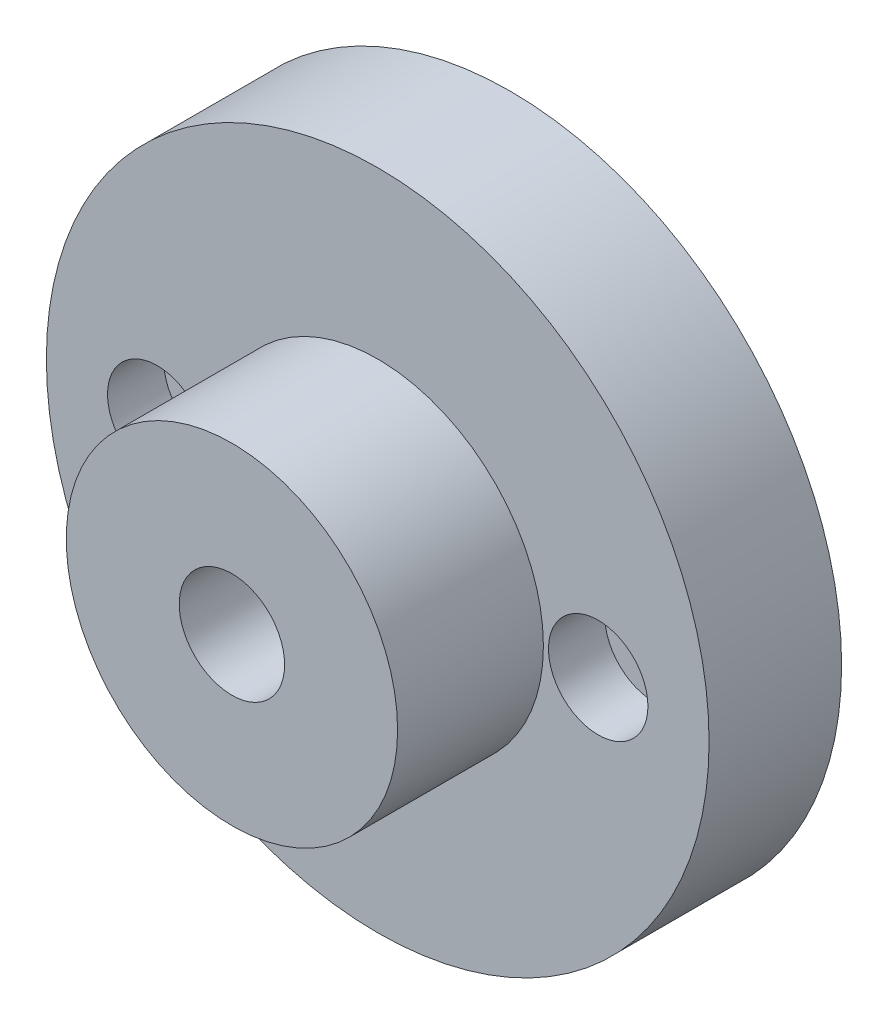
ISO-10303-21;
HEADER;
FILE_DESCRIPTION(('STEP AP214'),'2;1');
FILE_NAME('part.step','',(''),(''),'','','');
FILE_SCHEMA(('AUTOMOTIVE_DESIGN { 1 0 10303 214 1 1 1 1 }'));
ENDSEC;
DATA;
#1=APPLICATION_CONTEXT('core data for automotive mechanical design processes');
#2=APPLICATION_PROTOCOL_DEFINITION('international standard','automotive_design',2000,#1);
#3=PRODUCT_CONTEXT('',#1,'mechanical');
#4=PRODUCT('Part','Part','',(#3));
#5=PRODUCT_RELATED_PRODUCT_CATEGORY('part','',(#4));
#6=PRODUCT_DEFINITION_FORMATION('','',#4);
#7=PRODUCT_DEFINITION_CONTEXT('part definition',#1,'design');
#8=PRODUCT_DEFINITION('design','',#6,#7);
#9=PRODUCT_DEFINITION_SHAPE('','',#8);
#10=(LENGTH_UNIT() NAMED_UNIT(*) SI_UNIT(.MILLI.,.METRE.));
#11=(NAMED_UNIT(*) PLANE_ANGLE_UNIT() SI_UNIT($,.RADIAN.));
#12=(NAMED_UNIT(*) SI_UNIT($,.STERADIAN.) SOLID_ANGLE_UNIT());
#13=UNCERTAINTY_MEASURE_WITH_UNIT(LENGTH_MEASURE(1.E-05),#10,'distance_accuracy_value','');
#14=(GEOMETRIC_REPRESENTATION_CONTEXT(3) GLOBAL_UNCERTAINTY_ASSIGNED_CONTEXT((#13)) GLOBAL_UNIT_ASSIGNED_CONTEXT((#10,
#11,#12)) REPRESENTATION_CONTEXT('',''));
#15=CARTESIAN_POINT('',(0.,0.,0.));
#16=DIRECTION('',(0.,0.,1.));
#17=DIRECTION('',(1.,0.,0.));
#18=AXIS2_PLACEMENT_3D('',#15,#16,#17);
#19=CARTESIAN_POINT('',(8.45058,0.,5.08));
#20=DIRECTION('',(0.,0.,1.));
#21=DIRECTION('',(1.,0.,0.));
#22=AXIS2_PLACEMENT_3D('',#19,#20,#21);
#23=CYLINDRICAL_SURFACE('',#22,0.888999999999999);
#24=CARTESIAN_POINT('',(8.45058,0.,0.));
#25=DIRECTION('',(0.,0.,1.));
#26=DIRECTION('',(1.,0.,0.));
#27=AXIS2_PLACEMENT_3D('',#24,#25,#26);
#28=CIRCLE('',#27,0.888999999999999);
#29=CARTESIAN_POINT('',(9.33958,0.,0.));
#30=VERTEX_POINT('',#29);
#31=EDGE_CURVE('E75',#30,#30,#28,.T.);
#32=ORIENTED_EDGE('',*,*,#31,.F.);
#33=EDGE_LOOP('',(#32));
#34=FACE_BOUND('',#33,.T.);
#35=CARTESIAN_POINT('',(8.45058,0.,2.921));
#36=DIRECTION('',(0.,0.,1.));
#37=DIRECTION('',(1.,0.,0.));
#38=AXIS2_PLACEMENT_3D('',#35,#36,#37);
#39=CIRCLE('',#38,0.888999999999999);
#40=CARTESIAN_POINT('',(9.33958,0.,2.921));
#41=VERTEX_POINT('',#40);
#42=EDGE_CURVE('E40',#41,#41,#39,.F.);
#43=ORIENTED_EDGE('',*,*,#42,.F.);
#44=EDGE_LOOP('',(#43));
#45=FACE_BOUND('',#44,.T.);
#46=ADVANCED_FACE('F36',(#34,#45),#23,.F.);
#47=CARTESIAN_POINT('',(-8.45058,0.,5.08));
#48=DIRECTION('',(0.,0.,1.));
#49=DIRECTION('',(1.,0.,0.));
#50=AXIS2_PLACEMENT_3D('',#47,#48,#49);
#51=CYLINDRICAL_SURFACE('',#50,0.888999999999999);
#52=CARTESIAN_POINT('',(-8.45058,0.,0.));
#53=DIRECTION('',(0.,0.,1.));
#54=DIRECTION('',(1.,0.,0.));
#55=AXIS2_PLACEMENT_3D('',#52,#53,#54);
#56=CIRCLE('',#55,0.888999999999999);
#57=CARTESIAN_POINT('',(-7.56158,0.,0.));
#58=VERTEX_POINT('',#57);
#59=EDGE_CURVE('E72',#58,#58,#56,.T.);
#60=ORIENTED_EDGE('',*,*,#59,.F.);
#61=EDGE_LOOP('',(#60));
#62=FACE_BOUND('',#61,.T.);
#63=CARTESIAN_POINT('',(-8.45058,0.,2.921));
#64=DIRECTION('',(0.,0.,1.));
#65=DIRECTION('',(1.,0.,0.));
#66=AXIS2_PLACEMENT_3D('',#63,#64,#65);
#67=CIRCLE('',#66,0.888999999999999);
#68=CARTESIAN_POINT('',(-7.56158,0.,2.921));
#69=VERTEX_POINT('',#68);
#70=EDGE_CURVE('E66',#69,#69,#67,.F.);
#71=ORIENTED_EDGE('',*,*,#70,.F.);
#72=EDGE_LOOP('',(#71));
#73=FACE_BOUND('',#72,.T.);
#74=ADVANCED_FACE('F100',(#62,#73),#51,.F.);
#75=CARTESIAN_POINT('',(0.,0.,5.08));
#76=DIRECTION('',(0.,0.,-1.));
#77=DIRECTION('',(-1.,0.,0.));
#78=AXIS2_PLACEMENT_3D('',#75,#76,#77);
#79=CYLINDRICAL_SURFACE('',#78,12.7);
#80=CARTESIAN_POINT('',(0.,0.,5.08));
#81=DIRECTION('',(0.,0.,1.));
#82=DIRECTION('',(1.,0.,0.));
#83=AXIS2_PLACEMENT_3D('',#80,#81,#82);
#84=CIRCLE('',#83,12.7);
#85=CARTESIAN_POINT('',(12.7,0.,5.08));
#86=VERTEX_POINT('',#85);
#87=EDGE_CURVE('E44',#86,#86,#84,.T.);
#88=ORIENTED_EDGE('',*,*,#87,.F.);
#89=EDGE_LOOP('',(#88));
#90=FACE_BOUND('',#89,.T.);
#91=CARTESIAN_POINT('',(0.,0.,0.));
#92=DIRECTION('',(0.,0.,1.));
#93=DIRECTION('',(1.,0.,0.));
#94=AXIS2_PLACEMENT_3D('',#91,#92,#93);
#95=CIRCLE('',#94,12.7);
#96=CARTESIAN_POINT('',(12.7,0.,0.));
#97=VERTEX_POINT('',#96);
#98=EDGE_CURVE('E86',#97,#97,#95,.T.);
#99=ORIENTED_EDGE('',*,*,#98,.T.);
#100=EDGE_LOOP('',(#99));
#101=FACE_BOUND('',#100,.T.);
#102=ADVANCED_FACE('F38',(#90,#101),#79,.T.);
#103=CARTESIAN_POINT('',(0.,0.,5.08));
#104=DIRECTION('',(0.,0.,1.));
#105=DIRECTION('',(1.,0.,0.));
#106=AXIS2_PLACEMENT_3D('',#103,#104,#105);
#107=PLANE('',#106);
#108=CARTESIAN_POINT('',(-8.45058,0.,5.08));
#109=DIRECTION('',(0.,0.,1.));
#110=DIRECTION('',(1.,0.,0.));
#111=AXIS2_PLACEMENT_3D('',#108,#109,#110);
#112=CIRCLE('',#111,1.905);
#113=CARTESIAN_POINT('',(-6.54558,0.,5.08));
#114=VERTEX_POINT('',#113);
#115=EDGE_CURVE('E67',#114,#114,#112,.T.);
#116=ORIENTED_EDGE('',*,*,#115,.F.);
#117=EDGE_LOOP('',(#116));
#118=FACE_BOUND('',#117,.T.);
#119=CARTESIAN_POINT('',(8.45058,0.,5.08));
#120=DIRECTION('',(0.,0.,1.));
#121=DIRECTION('',(1.,0.,0.));
#122=AXIS2_PLACEMENT_3D('',#119,#120,#121);
#123=CIRCLE('',#122,1.905);
#124=CARTESIAN_POINT('',(10.35558,0.,5.08));
#125=VERTEX_POINT('',#124);
#126=EDGE_CURVE('E57',#125,#125,#123,.T.);
#127=ORIENTED_EDGE('',*,*,#126,.F.);
#128=EDGE_LOOP('',(#127));
#129=FACE_BOUND('',#128,.T.);
#130=CARTESIAN_POINT('',(0.,0.,5.08));
#131=DIRECTION('',(0.,0.,1.));
#132=DIRECTION('',(1.,0.,0.));
#133=AXIS2_PLACEMENT_3D('',#130,#131,#132);
#134=CIRCLE('',#133,6.35);
#135=CARTESIAN_POINT('',(6.35,0.,5.08));
#136=VERTEX_POINT('',#135);
#137=EDGE_CURVE('E11',#136,#136,#134,.T.);
#138=ORIENTED_EDGE('',*,*,#137,.F.);
#139=EDGE_LOOP('',(#138));
#140=FACE_BOUND('',#139,.T.);
#141=ORIENTED_EDGE('',*,*,#87,.T.);
#142=EDGE_LOOP('',(#141));
#143=FACE_BOUND('',#142,.T.);
#144=ADVANCED_FACE('F129',(#118,#129,#140,#143),#107,.T.);
#145=CARTESIAN_POINT('',(0.,0.,0.));
#146=DIRECTION('',(0.,0.,1.));
#147=DIRECTION('',(1.,0.,0.));
#148=AXIS2_PLACEMENT_3D('',#145,#146,#147);
#149=PLANE('',#148);
#150=CARTESIAN_POINT('',(1.99898,0.,0.));
#151=DIRECTION('',(0.,0.,-1.));
#152=DIRECTION('',(-1.,0.,0.));
#153=AXIS2_PLACEMENT_3D('',#150,#151,#152);
#154=CIRCLE('',#153,1.905);
#155=CARTESIAN_POINT('',(0.0939799999999994,0.,0.));
#156=VERTEX_POINT('',#155);
#157=EDGE_CURVE('E55',#156,#156,#154,.T.);
#158=ORIENTED_EDGE('',*,*,#157,.F.);
#159=EDGE_LOOP('',(#158));
#160=FACE_BOUND('',#159,.T.);
#161=ORIENTED_EDGE('',*,*,#59,.T.);
#162=EDGE_LOOP('',(#161));
#163=FACE_BOUND('',#162,.T.);
#164=ORIENTED_EDGE('',*,*,#31,.T.);
#165=EDGE_LOOP('',(#164));
#166=FACE_BOUND('',#165,.T.);
#167=ORIENTED_EDGE('',*,*,#98,.F.);
#168=EDGE_LOOP('',(#167));
#169=FACE_BOUND('',#168,.T.);
#170=ADVANCED_FACE('F127',(#160,#163,#166,#169),#149,.F.);
#171=CARTESIAN_POINT('',(0.,0.,10.668));
#172=DIRECTION('',(0.,0.,-1.));
#173=DIRECTION('',(-1.,0.,0.));
#174=AXIS2_PLACEMENT_3D('',#171,#172,#173);
#175=CYLINDRICAL_SURFACE('',#174,6.35);
#176=CARTESIAN_POINT('',(0.,0.,10.668));
#177=DIRECTION('',(0.,0.,1.));
#178=DIRECTION('',(1.,0.,0.));
#179=AXIS2_PLACEMENT_3D('',#176,#177,#178);
#180=CIRCLE('',#179,6.35);
#181=CARTESIAN_POINT('',(6.35,0.,10.668));
#182=VERTEX_POINT('',#181);
#183=EDGE_CURVE('E82',#182,#182,#180,.T.);
#184=ORIENTED_EDGE('',*,*,#183,.F.);
#185=EDGE_LOOP('',(#184));
#186=FACE_BOUND('',#185,.T.);
#187=ORIENTED_EDGE('',*,*,#137,.T.);
#188=EDGE_LOOP('',(#187));
#189=FACE_BOUND('',#188,.T.);
#190=ADVANCED_FACE('F123',(#186,#189),#175,.T.);
#191=CARTESIAN_POINT('',(0.,0.,10.668));
#192=DIRECTION('',(0.,0.,1.));
#193=DIRECTION('',(1.,0.,0.));
#194=AXIS2_PLACEMENT_3D('',#191,#192,#193);
#195=PLANE('',#194);
#196=CARTESIAN_POINT('',(0.,0.,10.668));
#197=DIRECTION('',(0.,0.,1.));
#198=DIRECTION('',(1.,0.,0.));
#199=AXIS2_PLACEMENT_3D('',#196,#197,#198);
#200=CIRCLE('',#199,2.0193);
#201=CARTESIAN_POINT('',(2.0193,0.,10.668));
#202=VERTEX_POINT('',#201);
#203=EDGE_CURVE('E78',#202,#202,#200,.T.);
#204=ORIENTED_EDGE('',*,*,#203,.F.);
#205=EDGE_LOOP('',(#204));
#206=FACE_BOUND('',#205,.T.);
#207=ORIENTED_EDGE('',*,*,#183,.T.);
#208=EDGE_LOOP('',(#207));
#209=FACE_BOUND('',#208,.T.);
#210=ADVANCED_FACE('F119',(#206,#209),#195,.T.);
#211=CARTESIAN_POINT('',(0.,0.,5.08));
#212=DIRECTION('',(0.,0.,1.));
#213=DIRECTION('',(1.,0.,0.));
#214=AXIS2_PLACEMENT_3D('',#211,#212,#213);
#215=CYLINDRICAL_SURFACE('',#214,2.0193);
#216=CARTESIAN_POINT('',(0.,0.,5.08));
#217=DIRECTION('',(0.,0.,1.));
#218=DIRECTION('',(1.,0.,0.));
#219=AXIS2_PLACEMENT_3D('',#216,#217,#218);
#220=CIRCLE('',#219,2.0193);
#221=CARTESIAN_POINT('',(2.0193,0.,5.08));
#222=VERTEX_POINT('',#221);
#223=EDGE_CURVE('E79',#222,#222,#220,.T.);
#224=ORIENTED_EDGE('',*,*,#223,.F.);
#225=EDGE_LOOP('',(#224));
#226=FACE_BOUND('',#225,.T.);
#227=ORIENTED_EDGE('',*,*,#203,.T.);
#228=EDGE_LOOP('',(#227));
#229=FACE_BOUND('',#228,.T.);
#230=ADVANCED_FACE('F115',(#226,#229),#215,.F.);
#231=CARTESIAN_POINT('',(0.,0.,5.08));
#232=DIRECTION('',(0.,0.,1.));
#233=DIRECTION('',(1.,0.,0.));
#234=AXIS2_PLACEMENT_3D('',#231,#232,#233);
#235=PLANE('',#234);
#236=ORIENTED_EDGE('',*,*,#223,.T.);
#237=EDGE_LOOP('',(#236));
#238=FACE_BOUND('',#237,.T.);
#239=ADVANCED_FACE('F111',(#238),#235,.T.);
#240=CARTESIAN_POINT('',(-8.45058,0.,2.921));
#241=DIRECTION('',(0.,0.,1.));
#242=DIRECTION('',(1.,0.,0.));
#243=AXIS2_PLACEMENT_3D('',#240,#241,#242);
#244=PLANE('',#243);
#245=CARTESIAN_POINT('',(-8.45058,0.,2.921));
#246=DIRECTION('',(0.,0.,1.));
#247=DIRECTION('',(1.,0.,0.));
#248=AXIS2_PLACEMENT_3D('',#245,#246,#247);
#249=CIRCLE('',#248,1.905);
#250=CARTESIAN_POINT('',(-6.54558,0.,2.921));
#251=VERTEX_POINT('',#250);
#252=EDGE_CURVE('E63',#251,#251,#249,.T.);
#253=ORIENTED_EDGE('',*,*,#252,.T.);
#254=EDGE_LOOP('',(#253));
#255=FACE_BOUND('',#254,.T.);
#256=ORIENTED_EDGE('',*,*,#70,.T.);
#257=EDGE_LOOP('',(#256));
#258=FACE_BOUND('',#257,.T.);
#259=ADVANCED_FACE('F114',(#255,#258),#244,.T.);
#260=CARTESIAN_POINT('',(-8.45058,0.,2.921));
#261=DIRECTION('',(0.,0.,1.));
#262=DIRECTION('',(1.,0.,0.));
#263=AXIS2_PLACEMENT_3D('',#260,#261,#262);
#264=CYLINDRICAL_SURFACE('',#263,1.905);
#265=ORIENTED_EDGE('',*,*,#252,.F.);
#266=EDGE_LOOP('',(#265));
#267=FACE_BOUND('',#266,.T.);
#268=ORIENTED_EDGE('',*,*,#115,.T.);
#269=EDGE_LOOP('',(#268));
#270=FACE_BOUND('',#269,.T.);
#271=ADVANCED_FACE('F166',(#267,#270),#264,.F.);
#272=CARTESIAN_POINT('',(8.45058,0.,2.921));
#273=DIRECTION('',(0.,0.,1.));
#274=DIRECTION('',(1.,0.,0.));
#275=AXIS2_PLACEMENT_3D('',#272,#273,#274);
#276=PLANE('',#275);
#277=CARTESIAN_POINT('',(8.45058,0.,2.921));
#278=DIRECTION('',(0.,0.,1.));
#279=DIRECTION('',(1.,0.,0.));
#280=AXIS2_PLACEMENT_3D('',#277,#278,#279);
#281=CIRCLE('',#280,1.905);
#282=CARTESIAN_POINT('',(10.35558,0.,2.921));
#283=VERTEX_POINT('',#282);
#284=EDGE_CURVE('E60',#283,#283,#281,.T.);
#285=ORIENTED_EDGE('',*,*,#284,.T.);
#286=EDGE_LOOP('',(#285));
#287=FACE_BOUND('',#286,.T.);
#288=ORIENTED_EDGE('',*,*,#42,.T.);
#289=EDGE_LOOP('',(#288));
#290=FACE_BOUND('',#289,.T.);
#291=ADVANCED_FACE('F97',(#287,#290),#276,.T.);
#292=CARTESIAN_POINT('',(8.45058,0.,2.921));
#293=DIRECTION('',(0.,0.,1.));
#294=DIRECTION('',(1.,0.,0.));
#295=AXIS2_PLACEMENT_3D('',#292,#293,#294);
#296=CYLINDRICAL_SURFACE('',#295,1.905);
#297=ORIENTED_EDGE('',*,*,#284,.F.);
#298=EDGE_LOOP('',(#297));
#299=FACE_BOUND('',#298,.T.);
#300=ORIENTED_EDGE('',*,*,#126,.T.);
#301=EDGE_LOOP('',(#300));
#302=FACE_BOUND('',#301,.T.);
#303=ADVANCED_FACE('F51',(#299,#302),#296,.F.);
#304=CARTESIAN_POINT('',(1.99898,0.,0.));
#305=DIRECTION('',(0.,0.,-1.));
#306=DIRECTION('',(-1.,0.,0.));
#307=AXIS2_PLACEMENT_3D('',#304,#305,#306);
#308=CONICAL_SURFACE('',#307,1.905,0.78539816339745);
#309=CARTESIAN_POINT('',(1.99898,0.,1.90499999999999));
#310=VERTEX_POINT('',#309);
#311=VERTEX_LOOP('',#310);
#312=FACE_BOUND('',#311,.T.);
#313=ORIENTED_EDGE('',*,*,#157,.T.);
#314=EDGE_LOOP('',(#313));
#315=FACE_BOUND('',#314,.T.);
#316=ADVANCED_FACE('F48',(#312,#315),#308,.F.);
#317=CLOSED_SHELL('',(#46,#74,#102,#144,#170,#190,#210,#230,#239,#259,#271,#291,#303,#316));
#318=MANIFOLD_SOLID_BREP('B2',#317);
#319=ADVANCED_BREP_SHAPE_REPRESENTATION('',(#18,#318),#14);
#320=SHAPE_DEFINITION_REPRESENTATION(#9,#319);
ENDSEC;
END-ISO-10303-21;
